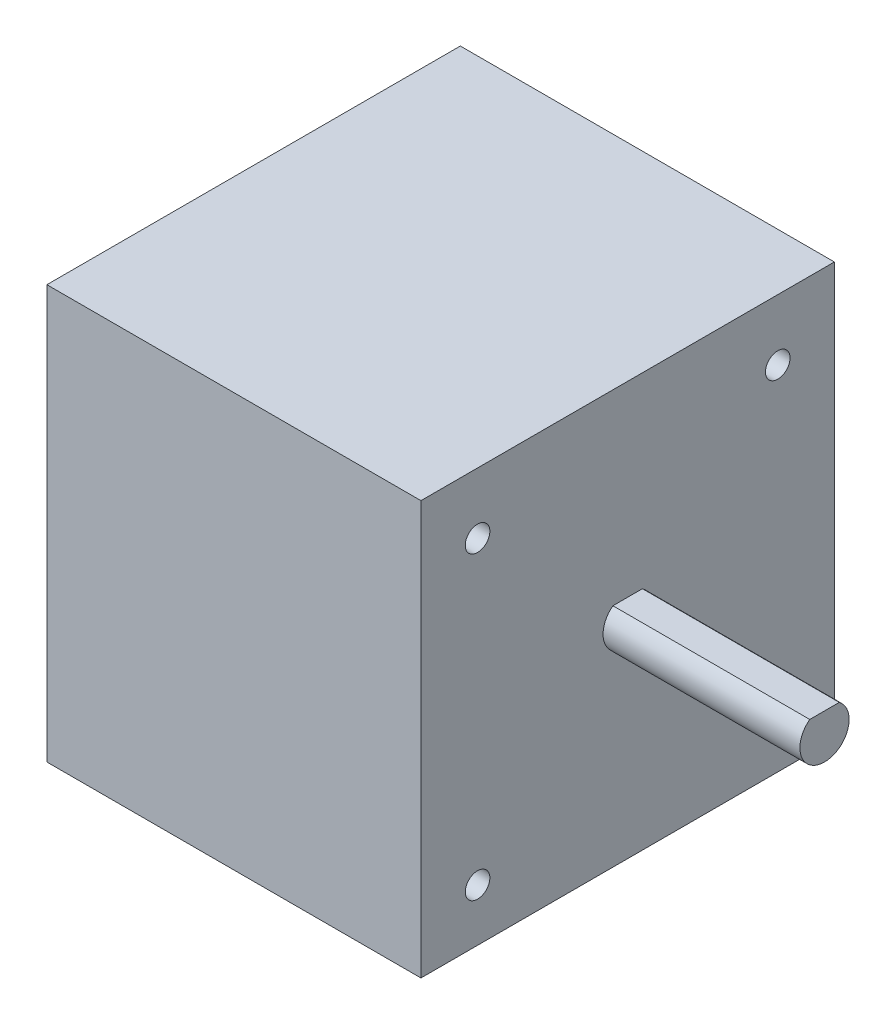
ISO-10303-21;
HEADER;
FILE_DESCRIPTION(('STEP AP214'),'2;1');
FILE_NAME('part.step','',(''),(''),'','','');
FILE_SCHEMA(('AUTOMOTIVE_DESIGN { 1 0 10303 214 1 1 1 1 }'));
ENDSEC;
DATA;
#1=APPLICATION_CONTEXT('core data for automotive mechanical design processes');
#2=APPLICATION_PROTOCOL_DEFINITION('international standard','automotive_design',2000,#1);
#3=PRODUCT_CONTEXT('',#1,'mechanical');
#4=PRODUCT('Part','Part','',(#3));
#5=PRODUCT_RELATED_PRODUCT_CATEGORY('part','',(#4));
#6=PRODUCT_DEFINITION_FORMATION('','',#4);
#7=PRODUCT_DEFINITION_CONTEXT('part definition',#1,'design');
#8=PRODUCT_DEFINITION('design','',#6,#7);
#9=PRODUCT_DEFINITION_SHAPE('','',#8);
#10=(LENGTH_UNIT() NAMED_UNIT(*) SI_UNIT(.MILLI.,.METRE.));
#11=(NAMED_UNIT(*) PLANE_ANGLE_UNIT() SI_UNIT($,.RADIAN.));
#12=(NAMED_UNIT(*) SI_UNIT($,.STERADIAN.) SOLID_ANGLE_UNIT());
#13=UNCERTAINTY_MEASURE_WITH_UNIT(LENGTH_MEASURE(1.E-05),#10,'distance_accuracy_value','');
#14=(GEOMETRIC_REPRESENTATION_CONTEXT(3) GLOBAL_UNCERTAINTY_ASSIGNED_CONTEXT((#13)) GLOBAL_UNIT_ASSIGNED_CONTEXT((#10,
#11,#12)) REPRESENTATION_CONTEXT('',''));
#15=CARTESIAN_POINT('',(0.,0.,0.));
#16=DIRECTION('',(0.,0.,1.));
#17=DIRECTION('',(1.,0.,0.));
#18=AXIS2_PLACEMENT_3D('',#15,#16,#17);
#19=CARTESIAN_POINT('',(38.,0.,0.));
#20=DIRECTION('',(1.,0.,0.));
#21=DIRECTION('',(0.,0.,-1.));
#22=AXIS2_PLACEMENT_3D('',#19,#20,#21);
#23=PLANE('',#22);
#24=CARTESIAN_POINT('',(38.,-15.6876278586913,15.25));
#25=DIRECTION('',(1.,0.,0.));
#26=DIRECTION('',(0.,0.,-1.));
#27=AXIS2_PLACEMENT_3D('',#24,#25,#26);
#28=CIRCLE('',#27,1.25);
#29=CARTESIAN_POINT('',(38.,-15.6876278586913,14.));
#30=VERTEX_POINT('',#29);
#31=EDGE_CURVE('E227',#30,#30,#28,.T.);
#32=ORIENTED_EDGE('',*,*,#31,.F.);
#33=EDGE_LOOP('',(#32));
#34=FACE_BOUND('',#33,.T.);
#35=CARTESIAN_POINT('',(38.,-15.6876278586913,-15.4767793349821));
#36=DIRECTION('',(1.,0.,0.));
#37=DIRECTION('',(0.,0.,-1.));
#38=AXIS2_PLACEMENT_3D('',#35,#36,#37);
#39=CIRCLE('',#38,1.25);
#40=CARTESIAN_POINT('',(38.,-15.6876278586913,-16.7267793349821));
#41=VERTEX_POINT('',#40);
#42=EDGE_CURVE('E219',#41,#41,#39,.T.);
#43=ORIENTED_EDGE('',*,*,#42,.F.);
#44=EDGE_LOOP('',(#43));
#45=FACE_BOUND('',#44,.T.);
#46=CARTESIAN_POINT('',(38.,14.8123721413087,-15.25));
#47=DIRECTION('',(1.,0.,0.));
#48=DIRECTION('',(0.,0.,-1.));
#49=AXIS2_PLACEMENT_3D('',#46,#47,#48);
#50=CIRCLE('',#49,1.25);
#51=CARTESIAN_POINT('',(38.,14.8123721413087,-16.5));
#52=VERTEX_POINT('',#51);
#53=EDGE_CURVE('E212',#52,#52,#50,.T.);
#54=ORIENTED_EDGE('',*,*,#53,.F.);
#55=EDGE_LOOP('',(#54));
#56=FACE_BOUND('',#55,.T.);
#57=CARTESIAN_POINT('',(38.,14.8123721413087,15.25));
#58=DIRECTION('',(1.,0.,0.));
#59=DIRECTION('',(0.,0.,-1.));
#60=AXIS2_PLACEMENT_3D('',#57,#58,#59);
#61=CIRCLE('',#60,1.25);
#62=CARTESIAN_POINT('',(38.,14.8123721413087,14.));
#63=VERTEX_POINT('',#62);
#64=EDGE_CURVE('E214',#63,#63,#61,.T.);
#65=ORIENTED_EDGE('',*,*,#64,.F.);
#66=EDGE_LOOP('',(#65));
#67=FACE_BOUND('',#66,.T.);
#68=DIRECTION('',(0.,1.,0.));
#69=VECTOR('',#68,1.);
#70=CARTESIAN_POINT('',(38.,21.,-21.));
#71=LINE('',#70,#69);
#72=CARTESIAN_POINT('',(38.,-21.,-21.));
#73=VERTEX_POINT('',#72);
#74=CARTESIAN_POINT('',(38.,21.,-21.));
#75=VERTEX_POINT('',#74);
#76=EDGE_CURVE('E123',#73,#75,#71,.T.);
#77=ORIENTED_EDGE('',*,*,#76,.T.);
#78=DIRECTION('',(0.,0.,1.));
#79=VECTOR('',#78,1.);
#80=CARTESIAN_POINT('',(38.,21.,21.));
#81=LINE('',#80,#79);
#82=CARTESIAN_POINT('',(38.,21.,21.));
#83=VERTEX_POINT('',#82);
#84=EDGE_CURVE('E90',#75,#83,#81,.T.);
#85=ORIENTED_EDGE('',*,*,#84,.T.);
#86=DIRECTION('',(0.,-1.,0.));
#87=VECTOR('',#86,1.);
#88=CARTESIAN_POINT('',(38.,21.,21.));
#89=LINE('',#88,#87);
#90=CARTESIAN_POINT('',(38.,-21.,21.));
#91=VERTEX_POINT('',#90);
#92=EDGE_CURVE('E126',#83,#91,#89,.T.);
#93=ORIENTED_EDGE('',*,*,#92,.T.);
#94=DIRECTION('',(0.,0.,-1.));
#95=VECTOR('',#94,1.);
#96=CARTESIAN_POINT('',(38.,-21.,21.));
#97=LINE('',#96,#95);
#98=EDGE_CURVE('E62',#91,#73,#97,.T.);
#99=ORIENTED_EDGE('',*,*,#98,.T.);
#100=EDGE_LOOP('',(#77,#85,#93,#99));
#101=FACE_BOUND('',#100,.T.);
#102=DIRECTION('',(0.,0.,1.));
#103=VECTOR('',#102,1.);
#104=CARTESIAN_POINT('',(38.,2.,1.5));
#105=LINE('',#104,#103);
#106=CARTESIAN_POINT('',(38.,2.,-1.5));
#107=VERTEX_POINT('',#106);
#108=CARTESIAN_POINT('',(38.,2.,1.5));
#109=VERTEX_POINT('',#108);
#110=EDGE_CURVE('E112',#107,#109,#105,.T.);
#111=ORIENTED_EDGE('',*,*,#110,.F.);
#112=CARTESIAN_POINT('',(38.,0.,0.));
#113=DIRECTION('',(1.,0.,0.));
#114=DIRECTION('',(0.,0.,-1.));
#115=AXIS2_PLACEMENT_3D('',#112,#113,#114);
#116=CIRCLE('',#115,2.5);
#117=EDGE_CURVE('E53',#109,#107,#116,.T.);
#118=ORIENTED_EDGE('',*,*,#117,.F.);
#119=EDGE_LOOP('',(#111,#118));
#120=FACE_BOUND('',#119,.T.);
#121=ADVANCED_FACE('F38',(#34,#45,#56,#67,#101,#120),#23,.T.);
#122=CARTESIAN_POINT('',(38.,21.,-21.));
#123=DIRECTION('',(0.,0.,1.));
#124=DIRECTION('',(0.,-1.,0.));
#125=AXIS2_PLACEMENT_3D('',#122,#123,#124);
#126=PLANE('',#125);
#127=DIRECTION('',(0.,1.,0.));
#128=VECTOR('',#127,1.);
#129=CARTESIAN_POINT('',(0.,21.,-21.));
#130=LINE('',#129,#128);
#131=CARTESIAN_POINT('',(0.,-21.,-21.));
#132=VERTEX_POINT('',#131);
#133=CARTESIAN_POINT('',(0.,21.,-21.));
#134=VERTEX_POINT('',#133);
#135=EDGE_CURVE('E115',#132,#134,#130,.T.);
#136=ORIENTED_EDGE('',*,*,#135,.T.);
#137=DIRECTION('',(-1.,0.,0.));
#138=VECTOR('',#137,1.);
#139=CARTESIAN_POINT('',(38.,21.,-21.));
#140=LINE('',#139,#138);
#141=EDGE_CURVE('E11',#75,#134,#140,.T.);
#142=ORIENTED_EDGE('',*,*,#141,.F.);
#143=ORIENTED_EDGE('',*,*,#76,.F.);
#144=DIRECTION('',(-1.,0.,0.));
#145=VECTOR('',#144,1.);
#146=CARTESIAN_POINT('',(38.,-21.,-21.));
#147=LINE('',#146,#145);
#148=EDGE_CURVE('E128',#73,#132,#147,.T.);
#149=ORIENTED_EDGE('',*,*,#148,.T.);
#150=EDGE_LOOP('',(#136,#142,#143,#149));
#151=FACE_BOUND('',#150,.T.);
#152=ADVANCED_FACE('F40',(#151),#126,.F.);
#153=CARTESIAN_POINT('',(38.,21.,21.));
#154=DIRECTION('',(0.,-1.,0.));
#155=DIRECTION('',(0.,0.,-1.));
#156=AXIS2_PLACEMENT_3D('',#153,#154,#155);
#157=PLANE('',#156);
#158=DIRECTION('',(0.,0.,1.));
#159=VECTOR('',#158,1.);
#160=CARTESIAN_POINT('',(0.,21.,21.));
#161=LINE('',#160,#159);
#162=CARTESIAN_POINT('',(0.,21.,21.));
#163=VERTEX_POINT('',#162);
#164=EDGE_CURVE('E118',#134,#163,#161,.T.);
#165=ORIENTED_EDGE('',*,*,#164,.T.);
#166=DIRECTION('',(-1.,0.,0.));
#167=VECTOR('',#166,1.);
#168=CARTESIAN_POINT('',(38.,21.,21.));
#169=LINE('',#168,#167);
#170=EDGE_CURVE('E46',#83,#163,#169,.T.);
#171=ORIENTED_EDGE('',*,*,#170,.F.);
#172=ORIENTED_EDGE('',*,*,#84,.F.);
#173=ORIENTED_EDGE('',*,*,#141,.T.);
#174=EDGE_LOOP('',(#165,#171,#172,#173));
#175=FACE_BOUND('',#174,.T.);
#176=ADVANCED_FACE('F156',(#175),#157,.F.);
#177=CARTESIAN_POINT('',(38.,21.,21.));
#178=DIRECTION('',(0.,0.,-1.));
#179=DIRECTION('',(0.,1.,0.));
#180=AXIS2_PLACEMENT_3D('',#177,#178,#179);
#181=PLANE('',#180);
#182=DIRECTION('',(0.,-1.,0.));
#183=VECTOR('',#182,1.);
#184=CARTESIAN_POINT('',(0.,21.,21.));
#185=LINE('',#184,#183);
#186=CARTESIAN_POINT('',(0.,-21.,21.));
#187=VERTEX_POINT('',#186);
#188=EDGE_CURVE('E131',#163,#187,#185,.T.);
#189=ORIENTED_EDGE('',*,*,#188,.T.);
#190=DIRECTION('',(-1.,0.,0.));
#191=VECTOR('',#190,1.);
#192=CARTESIAN_POINT('',(38.,-21.,21.));
#193=LINE('',#192,#191);
#194=EDGE_CURVE('E135',#91,#187,#193,.T.);
#195=ORIENTED_EDGE('',*,*,#194,.F.);
#196=ORIENTED_EDGE('',*,*,#92,.F.);
#197=ORIENTED_EDGE('',*,*,#170,.T.);
#198=EDGE_LOOP('',(#189,#195,#196,#197));
#199=FACE_BOUND('',#198,.T.);
#200=ADVANCED_FACE('F140',(#199),#181,.F.);
#201=CARTESIAN_POINT('',(38.,-21.,21.));
#202=DIRECTION('',(0.,1.,0.));
#203=DIRECTION('',(0.,0.,1.));
#204=AXIS2_PLACEMENT_3D('',#201,#202,#203);
#205=PLANE('',#204);
#206=DIRECTION('',(0.,0.,-1.));
#207=VECTOR('',#206,1.);
#208=CARTESIAN_POINT('',(0.,-21.,21.));
#209=LINE('',#208,#207);
#210=EDGE_CURVE('E83',#187,#132,#209,.T.);
#211=ORIENTED_EDGE('',*,*,#210,.T.);
#212=ORIENTED_EDGE('',*,*,#148,.F.);
#213=ORIENTED_EDGE('',*,*,#98,.F.);
#214=ORIENTED_EDGE('',*,*,#194,.T.);
#215=EDGE_LOOP('',(#211,#212,#213,#214));
#216=FACE_BOUND('',#215,.T.);
#217=ADVANCED_FACE('F148',(#216),#205,.F.);
#218=CARTESIAN_POINT('',(0.,0.,0.));
#219=DIRECTION('',(1.,0.,0.));
#220=DIRECTION('',(0.,0.,-1.));
#221=AXIS2_PLACEMENT_3D('',#218,#219,#220);
#222=PLANE('',#221);
#223=ORIENTED_EDGE('',*,*,#135,.F.);
#224=ORIENTED_EDGE('',*,*,#210,.F.);
#225=ORIENTED_EDGE('',*,*,#188,.F.);
#226=ORIENTED_EDGE('',*,*,#164,.F.);
#227=EDGE_LOOP('',(#223,#224,#225,#226));
#228=FACE_BOUND('',#227,.T.);
#229=ADVANCED_FACE('F144',(#228),#222,.F.);
#230=CARTESIAN_POINT('',(58.,0.,0.));
#231=DIRECTION('',(-1.,0.,0.));
#232=DIRECTION('',(0.,0.,1.));
#233=AXIS2_PLACEMENT_3D('',#230,#231,#232);
#234=CYLINDRICAL_SURFACE('',#233,2.5);
#235=ORIENTED_EDGE('',*,*,#117,.T.);
#236=DIRECTION('',(-1.,0.,0.));
#237=VECTOR('',#236,1.);
#238=CARTESIAN_POINT('',(58.,2.,-1.5));
#239=LINE('',#238,#237);
#240=CARTESIAN_POINT('',(58.,2.,-1.5));
#241=VERTEX_POINT('',#240);
#242=EDGE_CURVE('E104',#241,#107,#239,.T.);
#243=ORIENTED_EDGE('',*,*,#242,.F.);
#244=CARTESIAN_POINT('',(58.,0.,0.));
#245=DIRECTION('',(1.,0.,0.));
#246=DIRECTION('',(0.,0.,-1.));
#247=AXIS2_PLACEMENT_3D('',#244,#245,#246);
#248=CIRCLE('',#247,2.5);
#249=CARTESIAN_POINT('',(58.,2.,1.5));
#250=VERTEX_POINT('',#249);
#251=EDGE_CURVE('E109',#250,#241,#248,.T.);
#252=ORIENTED_EDGE('',*,*,#251,.F.);
#253=DIRECTION('',(-1.,0.,0.));
#254=VECTOR('',#253,1.);
#255=CARTESIAN_POINT('',(58.,2.,1.5));
#256=LINE('',#255,#254);
#257=EDGE_CURVE('E106',#250,#109,#256,.T.);
#258=ORIENTED_EDGE('',*,*,#257,.T.);
#259=EDGE_LOOP('',(#235,#243,#252,#258));
#260=FACE_BOUND('',#259,.T.);
#261=ADVANCED_FACE('F114',(#260),#234,.T.);
#262=CARTESIAN_POINT('',(58.,2.,1.5));
#263=DIRECTION('',(0.,-1.,0.));
#264=DIRECTION('',(0.,0.,-1.));
#265=AXIS2_PLACEMENT_3D('',#262,#263,#264);
#266=PLANE('',#265);
#267=ORIENTED_EDGE('',*,*,#110,.T.);
#268=ORIENTED_EDGE('',*,*,#257,.F.);
#269=DIRECTION('',(0.,0.,1.));
#270=VECTOR('',#269,1.);
#271=CARTESIAN_POINT('',(58.,2.,1.5));
#272=LINE('',#271,#270);
#273=EDGE_CURVE('E101',#241,#250,#272,.T.);
#274=ORIENTED_EDGE('',*,*,#273,.F.);
#275=ORIENTED_EDGE('',*,*,#242,.T.);
#276=EDGE_LOOP('',(#267,#268,#274,#275));
#277=FACE_BOUND('',#276,.T.);
#278=ADVANCED_FACE('F103',(#277),#266,.F.);
#279=CARTESIAN_POINT('',(58.,0.,0.));
#280=DIRECTION('',(1.,0.,0.));
#281=DIRECTION('',(0.,0.,-1.));
#282=AXIS2_PLACEMENT_3D('',#279,#280,#281);
#283=PLANE('',#282);
#284=ORIENTED_EDGE('',*,*,#251,.T.);
#285=ORIENTED_EDGE('',*,*,#273,.T.);
#286=EDGE_LOOP('',(#284,#285));
#287=FACE_BOUND('',#286,.T.);
#288=ADVANCED_FACE('F111',(#287),#283,.T.);
#289=CARTESIAN_POINT('',(18.,14.8123721413087,15.25));
#290=DIRECTION('',(1.,0.,0.));
#291=DIRECTION('',(0.,0.,-1.));
#292=AXIS2_PLACEMENT_3D('',#289,#290,#291);
#293=CYLINDRICAL_SURFACE('',#292,1.25);
#294=CARTESIAN_POINT('',(18.,14.8123721413087,15.25));
#295=DIRECTION('',(1.,0.,0.));
#296=DIRECTION('',(0.,0.,-1.));
#297=AXIS2_PLACEMENT_3D('',#294,#295,#296);
#298=CIRCLE('',#297,1.25);
#299=CARTESIAN_POINT('',(18.,14.8123721413087,14.));
#300=VERTEX_POINT('',#299);
#301=EDGE_CURVE('E217',#300,#300,#298,.T.);
#302=ORIENTED_EDGE('',*,*,#301,.F.);
#303=EDGE_LOOP('',(#302));
#304=FACE_BOUND('',#303,.T.);
#305=ORIENTED_EDGE('',*,*,#64,.T.);
#306=EDGE_LOOP('',(#305));
#307=FACE_BOUND('',#306,.T.);
#308=ADVANCED_FACE('F173',(#304,#307),#293,.F.);
#309=CARTESIAN_POINT('',(18.,14.8123721413087,15.25));
#310=DIRECTION('',(1.,0.,0.));
#311=DIRECTION('',(0.,0.,-1.));
#312=AXIS2_PLACEMENT_3D('',#309,#310,#311);
#313=PLANE('',#312);
#314=ORIENTED_EDGE('',*,*,#301,.T.);
#315=EDGE_LOOP('',(#314));
#316=FACE_BOUND('',#315,.T.);
#317=ADVANCED_FACE('F176',(#316),#313,.T.);
#318=CARTESIAN_POINT('',(18.,14.8123721413087,-15.25));
#319=DIRECTION('',(1.,0.,0.));
#320=DIRECTION('',(0.,0.,-1.));
#321=AXIS2_PLACEMENT_3D('',#318,#319,#320);
#322=CYLINDRICAL_SURFACE('',#321,1.25);
#323=CARTESIAN_POINT('',(18.,14.8123721413087,-15.25));
#324=DIRECTION('',(1.,0.,0.));
#325=DIRECTION('',(0.,0.,-1.));
#326=AXIS2_PLACEMENT_3D('',#323,#324,#325);
#327=CIRCLE('',#326,1.25);
#328=CARTESIAN_POINT('',(18.,14.8123721413087,-16.5));
#329=VERTEX_POINT('',#328);
#330=EDGE_CURVE('E209',#329,#329,#327,.T.);
#331=ORIENTED_EDGE('',*,*,#330,.F.);
#332=EDGE_LOOP('',(#331));
#333=FACE_BOUND('',#332,.T.);
#334=ORIENTED_EDGE('',*,*,#53,.T.);
#335=EDGE_LOOP('',(#334));
#336=FACE_BOUND('',#335,.T.);
#337=ADVANCED_FACE('F180',(#333,#336),#322,.F.);
#338=CARTESIAN_POINT('',(18.,14.8123721413087,-15.25));
#339=DIRECTION('',(1.,0.,0.));
#340=DIRECTION('',(0.,0.,-1.));
#341=AXIS2_PLACEMENT_3D('',#338,#339,#340);
#342=PLANE('',#341);
#343=ORIENTED_EDGE('',*,*,#330,.T.);
#344=EDGE_LOOP('',(#343));
#345=FACE_BOUND('',#344,.T.);
#346=ADVANCED_FACE('F197',(#345),#342,.T.);
#347=CARTESIAN_POINT('',(18.,-15.6876278586913,-15.4767793349821));
#348=DIRECTION('',(1.,0.,0.));
#349=DIRECTION('',(0.,0.,-1.));
#350=AXIS2_PLACEMENT_3D('',#347,#348,#349);
#351=CYLINDRICAL_SURFACE('',#350,1.25);
#352=CARTESIAN_POINT('',(18.,-15.6876278586913,-15.4767793349821));
#353=DIRECTION('',(1.,0.,0.));
#354=DIRECTION('',(0.,0.,-1.));
#355=AXIS2_PLACEMENT_3D('',#352,#353,#354);
#356=CIRCLE('',#355,1.25);
#357=CARTESIAN_POINT('',(18.,-15.6876278586913,-16.7267793349821));
#358=VERTEX_POINT('',#357);
#359=EDGE_CURVE('E224',#358,#358,#356,.T.);
#360=ORIENTED_EDGE('',*,*,#359,.F.);
#361=EDGE_LOOP('',(#360));
#362=FACE_BOUND('',#361,.T.);
#363=ORIENTED_EDGE('',*,*,#42,.T.);
#364=EDGE_LOOP('',(#363));
#365=FACE_BOUND('',#364,.T.);
#366=ADVANCED_FACE('F193',(#362,#365),#351,.F.);
#367=CARTESIAN_POINT('',(18.,-15.6876278586913,-15.4767793349821));
#368=DIRECTION('',(1.,0.,0.));
#369=DIRECTION('',(0.,0.,-1.));
#370=AXIS2_PLACEMENT_3D('',#367,#368,#369);
#371=PLANE('',#370);
#372=ORIENTED_EDGE('',*,*,#359,.T.);
#373=EDGE_LOOP('',(#372));
#374=FACE_BOUND('',#373,.T.);
#375=ADVANCED_FACE('F189',(#374),#371,.T.);
#376=CARTESIAN_POINT('',(18.,-15.6876278586913,15.25));
#377=DIRECTION('',(1.,0.,0.));
#378=DIRECTION('',(0.,0.,-1.));
#379=AXIS2_PLACEMENT_3D('',#376,#377,#378);
#380=CYLINDRICAL_SURFACE('',#379,1.25);
#381=CARTESIAN_POINT('',(18.,-15.6876278586913,15.25));
#382=DIRECTION('',(1.,0.,0.));
#383=DIRECTION('',(0.,0.,-1.));
#384=AXIS2_PLACEMENT_3D('',#381,#382,#383);
#385=CIRCLE('',#384,1.25);
#386=CARTESIAN_POINT('',(18.,-15.6876278586913,14.));
#387=VERTEX_POINT('',#386);
#388=EDGE_CURVE('E230',#387,#387,#385,.T.);
#389=ORIENTED_EDGE('',*,*,#388,.F.);
#390=EDGE_LOOP('',(#389));
#391=FACE_BOUND('',#390,.T.);
#392=ORIENTED_EDGE('',*,*,#31,.T.);
#393=EDGE_LOOP('',(#392));
#394=FACE_BOUND('',#393,.T.);
#395=ADVANCED_FACE('F185',(#391,#394),#380,.F.);
#396=CARTESIAN_POINT('',(18.,-15.6876278586913,15.25));
#397=DIRECTION('',(1.,0.,0.));
#398=DIRECTION('',(0.,0.,-1.));
#399=AXIS2_PLACEMENT_3D('',#396,#397,#398);
#400=PLANE('',#399);
#401=ORIENTED_EDGE('',*,*,#388,.T.);
#402=EDGE_LOOP('',(#401));
#403=FACE_BOUND('',#402,.T.);
#404=ADVANCED_FACE('F182',(#403),#400,.T.);
#405=CLOSED_SHELL('',(#121,#152,#176,#200,#217,#229,#261,#278,#288,#308,#317,#337,#346,#366,
#375,#395,#404));
#406=MANIFOLD_SOLID_BREP('B2',#405);
#407=ADVANCED_BREP_SHAPE_REPRESENTATION('',(#18,#406),#14);
#408=SHAPE_DEFINITION_REPRESENTATION(#9,#407);
ENDSEC;
END-ISO-10303-21;
